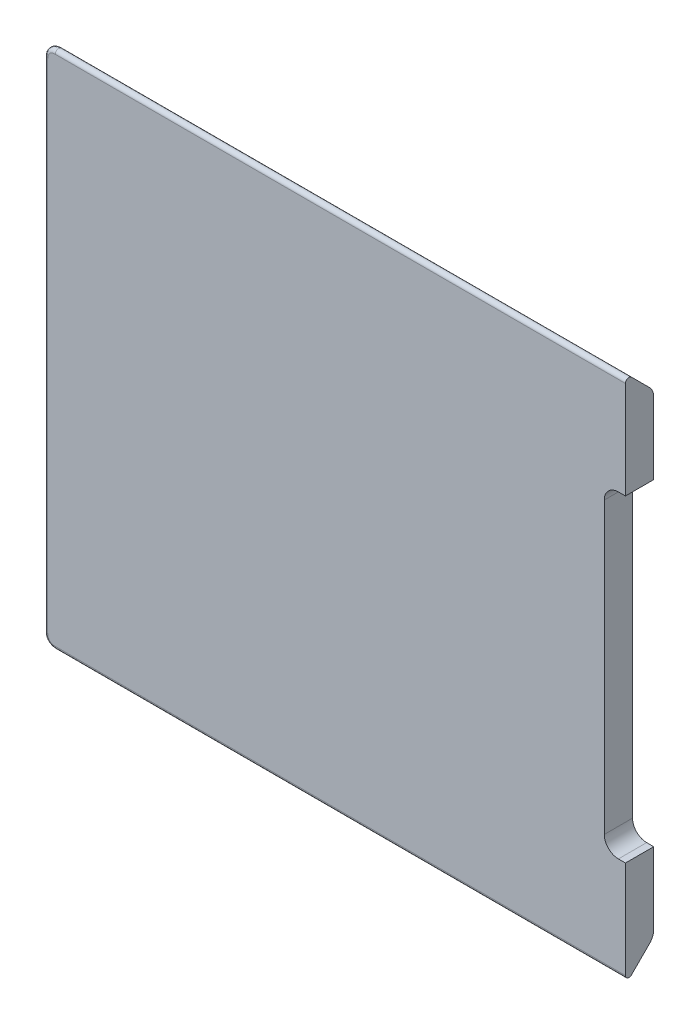
ISO-10303-21;
HEADER;
FILE_DESCRIPTION(('STEP AP214'),'2;1');
FILE_NAME('part.step','',(''),(''),'','','');
FILE_SCHEMA(('AUTOMOTIVE_DESIGN { 1 0 10303 214 1 1 1 1 }'));
ENDSEC;
DATA;
#1=APPLICATION_CONTEXT('core data for automotive mechanical design processes');
#2=APPLICATION_PROTOCOL_DEFINITION('international standard','automotive_design',2000,#1);
#3=PRODUCT_CONTEXT('',#1,'mechanical');
#4=PRODUCT('Part','Part','',(#3));
#5=PRODUCT_RELATED_PRODUCT_CATEGORY('part','',(#4));
#6=PRODUCT_DEFINITION_FORMATION('','',#4);
#7=PRODUCT_DEFINITION_CONTEXT('part definition',#1,'design');
#8=PRODUCT_DEFINITION('design','',#6,#7);
#9=PRODUCT_DEFINITION_SHAPE('','',#8);
#10=(LENGTH_UNIT() NAMED_UNIT(*) SI_UNIT(.MILLI.,.METRE.));
#11=(NAMED_UNIT(*) PLANE_ANGLE_UNIT() SI_UNIT($,.RADIAN.));
#12=(NAMED_UNIT(*) SI_UNIT($,.STERADIAN.) SOLID_ANGLE_UNIT());
#13=UNCERTAINTY_MEASURE_WITH_UNIT(LENGTH_MEASURE(1.E-05),#10,'distance_accuracy_value','');
#14=(GEOMETRIC_REPRESENTATION_CONTEXT(3) GLOBAL_UNCERTAINTY_ASSIGNED_CONTEXT((#13)) GLOBAL_UNIT_ASSIGNED_CONTEXT((#10,
#11,#12)) REPRESENTATION_CONTEXT('',''));
#15=CARTESIAN_POINT('',(0.,0.,0.));
#16=DIRECTION('',(0.,0.,1.));
#17=DIRECTION('',(1.,0.,0.));
#18=AXIS2_PLACEMENT_3D('',#15,#16,#17);
#19=CARTESIAN_POINT('',(-3.00496428663334,-69.8231491568325,36.6728417155403));
#20=CARTESIAN_POINT('',(-3.0049642866328,-69.6417599665671,36.6728417155394));
#21=CARTESIAN_POINT('',(-2.94169411988399,-69.3107853670417,36.6728417155379));
#22=CARTESIAN_POINT('',(-2.62026495891638,-68.8928204622767,36.6728417155359));
#23=CARTESIAN_POINT('',(-2.22699450196718,-68.7730955867716,36.6728417155354));
#24=CARTESIAN_POINT('',(-1.95491071656874,-68.7730955867714,36.6728417155354));
#25=CARTESIAN_POINT('',(-3.11604202688526,-69.8231491568321,36.6728417155403));
#26=CARTESIAN_POINT('',(-3.11874544267914,-69.6289801714833,36.6728860846063));
#27=CARTESIAN_POINT('',(-3.05717731561895,-69.2651335654739,36.6729506764739));
#28=CARTESIAN_POINT('',(-2.68916523885976,-68.7830387092416,36.6729798260699));
#29=CARTESIAN_POINT('',(-2.24616419459224,-68.6579627228283,36.6729082691352));
#30=CARTESIAN_POINT('',(-1.95491071656882,-68.6620178465197,36.6728417155349));
#31=CARTESIAN_POINT('',(-3.33797296559265,-69.8231491568319,36.595153565734));
#32=CARTESIAN_POINT('',(-3.34607701863612,-69.6034179349615,36.5911989278276));
#33=CARTESIAN_POINT('',(-3.28797598094053,-69.1739449843441,36.5842014219234));
#34=CARTESIAN_POINT('',(-2.82680672200666,-68.5636316265411,36.5812229193344));
#35=CARTESIAN_POINT('',(-2.28450754937456,-68.4279308282474,36.5892216088699));
#36=CARTESIAN_POINT('',(-1.95491071656898,-68.4400869078132,36.5951535657278));
#37=CARTESIAN_POINT('',(-3.50968083144635,-69.8231491568326,36.3215003048124));
#38=CARTESIAN_POINT('',(-3.51571206277398,-69.5836147494334,36.3059013845933));
#39=CARTESIAN_POINT('',(-3.44727777278209,-69.1085180758411,36.2790321294264));
#40=CARTESIAN_POINT('',(-2.92049494913923,-68.4159585207845,36.2678463301518));
#41=CARTESIAN_POINT('',(-2.31421232766808,-68.2593321949684,36.2981019244797));
#42=CARTESIAN_POINT('',(-1.9549107165691,-68.2683790419606,36.3215003048065));
#43=CARTESIAN_POINT('',(-3.5009973500986,-69.823149156834,36.0348337081705));
#44=CARTESIAN_POINT('',(-3.49552275177714,-69.5846419368623,36.0120697821309));
#45=CARTESIAN_POINT('',(-3.40415970385293,-69.121168241449,35.9747058155872));
#46=CARTESIAN_POINT('',(-2.89268977031777,-68.4633909706156,35.9597698201485));
#47=CARTESIAN_POINT('',(-2.31267154652697,-68.28527442079,36.0006878191078));
#48=CARTESIAN_POINT('',(-1.95491071656909,-68.2770625233087,36.0348337081653));
#49=CARTESIAN_POINT('',(-3.41389001084896,-69.8231491568349,35.8867317263812));
#50=CARTESIAN_POINT('',(-3.39859972627252,-69.5946289625485,35.8646262894568));
#51=CARTESIAN_POINT('',(-3.29151917534255,-69.1630700849447,35.8304125853742));
#52=CARTESIAN_POINT('',(-2.8240975646465,-68.5744360054401,35.817462641883));
#53=CARTESIAN_POINT('',(-2.29769100799933,-68.3871052894218,35.8535735709916));
#54=CARTESIAN_POINT('',(-1.95491071656903,-68.3641698625581,35.8867317263763));
#55=CARTESIAN_POINT('',(-3.3549821433207,-69.8231491568354,35.827823858853));
#56=CARTESIAN_POINT('',(-3.33482778884606,-69.6014512576221,35.8076695043779));
#57=CARTESIAN_POINT('',(-3.22072262953946,-69.1898967285637,35.7779245674011));
#58=CARTESIAN_POINT('',(-2.78142422116171,-68.6433363826317,35.7671983736439));
#59=CARTESIAN_POINT('',(-2.28745756538958,-68.4533092617972,35.7975923271375));
#60=CARTESIAN_POINT('',(-1.95491071656899,-68.4230777300862,35.8278238588482));
#61=B_SPLINE_SURFACE_WITH_KNOTS('',3,3,((#19,#20,#21,#22,#23,#24),(#25,#26,#27,#28,#29,#30),
(#31,#32,#33,#34,#35,#36),(#37,#38,#39,#40,#41,#42),(#43,#44,#45,#46,#47,#48),(#49,#50,#51,#52,
#53,#54),(#55,#56,#57,#58,#59,#60)),.UNSPECIFIED.,.F.,.F.,.F.,(4,1,1,1,4),(4,1,1,4),(0.,
0.285714285714286,0.571428571428571,0.785714285714286,1.),(-0.523598775597764,
-0.224399475255628,0.0747998250865082,0.523598775599713),.UNSPECIFIED.);
#62=CARTESIAN_POINT('',(-3.00496428663334,-69.8231491568325,36.6728417155403));
#63=CARTESIAN_POINT('',(-3.0049642866328,-69.6417599665671,36.6728417155394));
#64=CARTESIAN_POINT('',(-2.94169411988399,-69.3107853670417,36.6728417155379));
#65=CARTESIAN_POINT('',(-2.62026495891638,-68.8928204622767,36.6728417155359));
#66=CARTESIAN_POINT('',(-2.22699450196718,-68.7730955867716,36.6728417155354));
#67=CARTESIAN_POINT('',(-1.95491071656874,-68.7730955867714,36.6728417155354));
#68=B_SPLINE_CURVE_WITH_KNOTS('',3,(#62,#63,#64,#65,#66,#67),.UNSPECIFIED.,.F.,.F.,(4,1,1,4),
(-0.523598775597764,-0.224399475255628,0.0747998250865082,0.523598775599713),.UNSPECIFIED.);
#69=CARTESIAN_POINT('',(-1.95491071656881,-68.7730955867729,36.6728417155354));
#70=VERTEX_POINT('',#69);
#71=CARTESIAN_POINT('',(-3.00496428663383,-69.8231491568325,36.6728417155403));
#72=VERTEX_POINT('',#71);
#73=EDGE_CURVE('E506',#70,#72,#68,.F.);
#74=CARTESIAN_POINT('',(-1.95491071656874,-68.7730955867714,36.6728417155354));
#75=CARTESIAN_POINT('',(-1.95491071656882,-68.6620178465197,36.6728417155349));
#76=CARTESIAN_POINT('',(-1.95491071656898,-68.4400869078132,36.5951535657278));
#77=CARTESIAN_POINT('',(-1.9549107165691,-68.2683790419606,36.3215003048065));
#78=CARTESIAN_POINT('',(-1.95491071656909,-68.2770625233087,36.0348337081653));
#79=CARTESIAN_POINT('',(-1.95491071656903,-68.3641698625581,35.8867317263763));
#80=CARTESIAN_POINT('',(-1.95491071656899,-68.4230777300862,35.8278238588482));
#81=B_SPLINE_CURVE_WITH_KNOTS('',3,(#74,#75,#76,#77,#78,#79,#80),.UNSPECIFIED.,.F.,.F.,(4,1,1,1,
4),(0.,0.285714285714286,0.571428571428571,0.785714285714286,1.),.UNSPECIFIED.);
#82=CARTESIAN_POINT('',(-1.9549107165689,-68.423077730088,35.8278238588481));
#83=VERTEX_POINT('',#82);
#84=EDGE_CURVE('E510',#83,#70,#81,.F.);
#85=CARTESIAN_POINT('',(-1.95491071656899,-68.4230777300862,35.8278238588482));
#86=CARTESIAN_POINT('',(-2.28745756538958,-68.4533092617972,35.7975923271375));
#87=CARTESIAN_POINT('',(-2.78142422116171,-68.6433363826317,35.7671983736439));
#88=CARTESIAN_POINT('',(-3.22072262953946,-69.1898967285637,35.7779245674011));
#89=CARTESIAN_POINT('',(-3.33482778884606,-69.6014512576221,35.8076695043779));
#90=CARTESIAN_POINT('',(-3.3549821433207,-69.8231491568354,35.827823858853));
#91=B_SPLINE_CURVE_WITH_KNOTS('',3,(#85,#86,#87,#88,#89,#90),.UNSPECIFIED.,.F.,.F.,(4,1,1,4),
(-0.523598775597764,-0.0747998250845592,0.224399475257577,0.523598775599713),.UNSPECIFIED.);
#92=CARTESIAN_POINT('',(-3.35498214334945,-69.82314915678,35.8278238588801));
#93=VERTEX_POINT('',#92);
#94=EDGE_CURVE('E125',#93,#83,#91,.F.);
#95=CARTESIAN_POINT('',(-3.3549821433207,-69.8231491568354,35.827823858853));
#96=CARTESIAN_POINT('',(-3.41389001084896,-69.8231491568349,35.8867317263812));
#97=CARTESIAN_POINT('',(-3.5009973500986,-69.823149156834,36.0348337081705));
#98=CARTESIAN_POINT('',(-3.50968083144635,-69.8231491568326,36.3215003048124));
#99=CARTESIAN_POINT('',(-3.33797296559265,-69.8231491568319,36.595153565734));
#100=CARTESIAN_POINT('',(-3.11604202688526,-69.8231491568321,36.6728417155403));
#101=CARTESIAN_POINT('',(-3.00496428663334,-69.8231491568325,36.6728417155403));
#102=B_SPLINE_CURVE_WITH_KNOTS('',3,(#95,#96,#97,#98,#99,#100,#101),.UNSPECIFIED.,.F.,.F.,(4,1,
1,1,4),(0.,0.214285714285714,0.428571428571429,0.714285714285714,1.),.UNSPECIFIED.);
#103=EDGE_CURVE('E116',#72,#93,#102,.F.);
#104=ORIENTED_EDGE('',*,*,#73,.F.);
#105=ORIENTED_EDGE('',*,*,#84,.F.);
#106=ORIENTED_EDGE('',*,*,#94,.F.);
#107=ORIENTED_EDGE('',*,*,#103,.F.);
#108=EDGE_LOOP('',(#104,#105,#106,#107));
#109=FACE_BOUND('',#108,.T.);
#110=ADVANCED_FACE('F17',(#109),#61,.F.);
#111=CARTESIAN_POINT('',(0.580142853498731,-72.3582027269058,34.6928417155298));
#112=DIRECTION('',(-0.270598050073099,0.270598050073099,-0.923879532511287));
#113=DIRECTION('',(0.959682982260667,0.,-0.281084637714821));
#114=AXIS2_PLACEMENT_3D('',#111,#112,#113);
#115=SPHERICAL_SURFACE('',#114,1.98);
#116=CARTESIAN_POINT('',(0.0443587143539955,-71.8224185877611,32.8635602411575));
#117=VERTEX_POINT('',#116);
#118=VERTEX_LOOP('',#117);
#119=FACE_BOUND('',#118,.T.);
#120=CARTESIAN_POINT('',(0.580142853498731,-72.3582027269058,34.6928417155298));
#121=DIRECTION('',(1.,0.,0.));
#122=DIRECTION('',(0.,0.,-1.));
#123=AXIS2_PLACEMENT_3D('',#120,#121,#122);
#124=CIRCLE('',#123,1.98);
#125=CARTESIAN_POINT('',(0.580142853498731,-72.3582027269058,32.7128417155298));
#126=VERTEX_POINT('',#125);
#127=CARTESIAN_POINT('',(0.580142853498721,-70.9581313001564,33.2927702887805));
#128=VERTEX_POINT('',#127);
#129=EDGE_CURVE('E118',#126,#128,#124,.T.);
#130=ORIENTED_EDGE('',*,*,#129,.F.);
#131=CARTESIAN_POINT('',(0.580142853498731,-72.3582027269058,34.6928417155298));
#132=DIRECTION('',(0.,-1.,0.));
#133=DIRECTION('',(0.,0.,-1.));
#134=AXIS2_PLACEMENT_3D('',#131,#132,#133);
#135=CIRCLE('',#134,1.98);
#136=CARTESIAN_POINT('',(-0.819928573250678,-72.3582027269058,33.2927702887805));
#137=VERTEX_POINT('',#136);
#138=EDGE_CURVE('E24',#126,#137,#135,.F.);
#139=ORIENTED_EDGE('',*,*,#138,.T.);
#140=CARTESIAN_POINT('',(0.580142853498698,-72.3582027269058,34.6928417155298));
#141=DIRECTION('',(0.577350269189626,-0.577350269189625,-0.577350269189626));
#142=DIRECTION('',(-0.707106781186547,0.,-0.707106781186547));
#143=AXIS2_PLACEMENT_3D('',#140,#141,#142);
#144=CIRCLE('',#143,1.98);
#145=EDGE_CURVE('E121',#128,#137,#144,.F.);
#146=ORIENTED_EDGE('',*,*,#145,.F.);
#147=EDGE_LOOP('',(#130,#139,#146));
#148=FACE_BOUND('',#147,.T.);
#149=ADVANCED_FACE('F120',(#119,#148),#115,.T.);
#150=CARTESIAN_POINT('',(-1.95491071690341,-140.633024160384,36.6728417158714));
#151=CARTESIAN_POINT('',(-2.22699450230281,-140.633024160384,36.6728417158714));
#152=CARTESIAN_POINT('',(-2.62025383510631,-140.513284038942,36.6728417158709));
#153=CARTESIAN_POINT('',(-2.94168802214441,-140.095326470196,36.6728417158689));
#154=CARTESIAN_POINT('',(-3.00496428696518,-139.764359780586,36.6728417158673));
#155=CARTESIAN_POINT('',(-3.00496428696446,-139.582970590319,36.6728417158665));
#156=CARTESIAN_POINT('',(-1.95491071690321,-140.744101900636,36.6728417158719));
#157=CARTESIAN_POINT('',(-2.24616419492771,-140.748157024328,36.6729082694723));
#158=CARTESIAN_POINT('',(-2.68920792701886,-140.623045714494,36.6729922075104));
#159=CARTESIAN_POINT('',(-3.0572039477673,-140.140971717587,36.672958956598));
#160=CARTESIAN_POINT('',(-3.11874544301159,-139.777139575668,36.6728860849343));
#161=CARTESIAN_POINT('',(-3.11604202721637,-139.582970590319,36.6728417158665));
#162=CARTESIAN_POINT('',(-1.95491071690283,-140.966031054386,36.595144452796));
#163=CARTESIAN_POINT('',(-2.28450754970972,-140.978187133953,36.589212495938));
#164=CARTESIAN_POINT('',(-2.82696347593654,-140.842421339197,36.5812107983052));
#165=CARTESIAN_POINT('',(-3.28807399838253,-140.232150673551,36.5841898209763));
#166=CARTESIAN_POINT('',(-3.34607523401095,-139.802701812189,36.5911898148856));
#167=CARTESIAN_POINT('',(-3.33797118096597,-139.582970590318,36.5951444527899));
#168=CARTESIAN_POINT('',(-1.95491071690254,-141.137737082671,36.3214961519573));
#169=CARTESIAN_POINT('',(-2.31421232800284,-141.146783929665,36.2980977716301));
#170=CARTESIAN_POINT('',(-2.92070150272886,-140.990089968671,36.2678448666628));
#171=CARTESIAN_POINT('',(-3.44740901166946,-140.297576884246,36.2790281626689));
#172=CARTESIAN_POINT('',(-3.51570844057935,-139.822504997719,36.3058972317345));
#173=CARTESIAN_POINT('',(-3.50967720925006,-139.582970590319,36.3214961519514));
#174=CARTESIAN_POINT('',(-1.95491071690255,-141.129051708278,36.034831063988));
#175=CARTESIAN_POINT('',(-2.31267154686145,-141.120839810798,36.0006851749299));
#176=CARTESIAN_POINT('',(-2.89280598781092,-140.942665083103,35.9597609089001));
#177=CARTESIAN_POINT('',(-3.40423096759155,-140.284926243157,35.9746972257442));
#178=CARTESIAN_POINT('',(-3.49551723653683,-139.821477810293,36.0120671379453));
#179=CARTESIAN_POINT('',(-3.50099183485664,-139.58297059032,36.0348310639828));
#180=CARTESIAN_POINT('',(-1.9549107169027,-141.041949884602,35.8867317267125));
#181=CARTESIAN_POINT('',(-2.29769100833374,-141.019014457739,35.8535735713271));
#182=CARTESIAN_POINT('',(-2.82414213081282,-140.831665166817,35.8174643697151));
#183=CARTESIAN_POINT('',(-3.29155106943329,-140.243042040226,35.8304127615578));
#184=CARTESIAN_POINT('',(-3.39859972660533,-139.811490784609,35.8646262897853));
#185=CARTESIAN_POINT('',(-3.41389001118018,-139.582970590321,35.8867317267076));
#186=CARTESIAN_POINT('',(-1.9549107169028,-140.983042017073,35.8278238591841));
#187=CARTESIAN_POINT('',(-2.28745756572399,-140.952810485363,35.7975923274728));
#188=CARTESIAN_POINT('',(-2.78141231931042,-140.762765966622,35.767201303988));
#189=CARTESIAN_POINT('',(-3.22071605555198,-140.216214028485,35.7779261241758));
#190=CARTESIAN_POINT('',(-3.33482778917884,-139.804668489536,35.8076695047063));
#191=CARTESIAN_POINT('',(-3.35498214365196,-139.582970590322,35.8278238591793));
#192=B_SPLINE_SURFACE_WITH_KNOTS('',3,3,((#150,#151,#152,#153,#154,#155),(#156,#157,#158,#159,
#160,#161),(#162,#163,#164,#165,#166,#167),(#168,#169,#170,#171,#172,#173),(#174,#175,#176,#177,
#178,#179),(#180,#181,#182,#183,#184,#185),(#186,#187,#188,#189,#190,#191)),.UNSPECIFIED.,.F.,
.F.,.F.,(4,1,1,1,4),(4,1,1,4),(0.,0.285714285714286,0.571428571428571,0.785714285714286,1.),
(-0.523598775597767,-0.0747998250845623,0.224399475257574,0.523598775599711),.UNSPECIFIED.);
#193=CARTESIAN_POINT('',(-1.95491071690341,-140.633024160384,36.6728417158714));
#194=CARTESIAN_POINT('',(-2.22699450230281,-140.633024160384,36.6728417158714));
#195=CARTESIAN_POINT('',(-2.62025383510631,-140.513284038942,36.6728417158709));
#196=CARTESIAN_POINT('',(-2.94168802214441,-140.095326470196,36.6728417158689));
#197=CARTESIAN_POINT('',(-3.00496428696518,-139.764359780586,36.6728417158673));
#198=CARTESIAN_POINT('',(-3.00496428696446,-139.582970590319,36.6728417158665));
#199=B_SPLINE_CURVE_WITH_KNOTS('',3,(#193,#194,#195,#196,#197,#198),.UNSPECIFIED.,.F.,.F.,(4,1,
1,4),(-0.523598775597767,-0.0747998250845623,0.224399475257574,0.523598775599711),.UNSPECIFIED.);
#200=CARTESIAN_POINT('',(-3.00496428696299,-139.582970590319,36.6728417158665));
#201=VERTEX_POINT('',#200);
#202=CARTESIAN_POINT('',(-1.95491071690341,-140.633024160384,36.6728417158714));
#203=VERTEX_POINT('',#202);
#204=EDGE_CURVE('E332',#201,#203,#199,.F.);
#205=CARTESIAN_POINT('',(-3.00496428696446,-139.582970590319,36.6728417158665));
#206=CARTESIAN_POINT('',(-3.11604202721637,-139.582970590319,36.6728417158665));
#207=CARTESIAN_POINT('',(-3.33797118096597,-139.582970590318,36.5951444527899));
#208=CARTESIAN_POINT('',(-3.50967720925006,-139.582970590319,36.3214961519514));
#209=CARTESIAN_POINT('',(-3.50099183485664,-139.58297059032,36.0348310639828));
#210=CARTESIAN_POINT('',(-3.41389001118018,-139.582970590321,35.8867317267076));
#211=CARTESIAN_POINT('',(-3.35498214365196,-139.582970590322,35.8278238591793));
#212=B_SPLINE_CURVE_WITH_KNOTS('',3,(#205,#206,#207,#208,#209,#210,#211),.UNSPECIFIED.,.F.,.F.,
(4,1,1,1,4),(0.,0.285714285714286,0.571428571428571,0.785714285714286,1.),.UNSPECIFIED.);
#213=CARTESIAN_POINT('',(-3.35498214365021,-139.582970590322,35.8278238591792));
#214=VERTEX_POINT('',#213);
#215=EDGE_CURVE('E115',#214,#201,#212,.F.);
#216=CARTESIAN_POINT('',(-3.35498214365196,-139.582970590322,35.8278238591793));
#217=CARTESIAN_POINT('',(-3.33482778917884,-139.804668489536,35.8076695047063));
#218=CARTESIAN_POINT('',(-3.22071605555198,-140.216214028485,35.7779261241758));
#219=CARTESIAN_POINT('',(-2.78141231931042,-140.762765966622,35.767201303988));
#220=CARTESIAN_POINT('',(-2.28745756572399,-140.952810485363,35.7975923274728));
#221=CARTESIAN_POINT('',(-1.9549107169028,-140.983042017073,35.8278238591841));
#222=B_SPLINE_CURVE_WITH_KNOTS('',3,(#216,#217,#218,#219,#220,#221),.UNSPECIFIED.,.F.,.F.,(4,1,
1,4),(-0.523598775597767,-0.22439947525563,0.0747998250865063,0.523598775599711),.UNSPECIFIED.);
#223=CARTESIAN_POINT('',(-1.95491071690361,-140.983042017075,35.8278238591841));
#224=VERTEX_POINT('',#223);
#225=EDGE_CURVE('E431',#224,#214,#222,.F.);
#226=CARTESIAN_POINT('',(-1.9549107169028,-140.983042017073,35.8278238591841));
#227=CARTESIAN_POINT('',(-1.9549107169027,-141.041949884602,35.8867317267125));
#228=CARTESIAN_POINT('',(-1.95491071690255,-141.129051708278,36.034831063988));
#229=CARTESIAN_POINT('',(-1.95491071690254,-141.137737082671,36.3214961519573));
#230=CARTESIAN_POINT('',(-1.95491071690283,-140.966031054386,36.595144452796));
#231=CARTESIAN_POINT('',(-1.95491071690321,-140.744101900636,36.6728417158719));
#232=CARTESIAN_POINT('',(-1.95491071690341,-140.633024160384,36.6728417158714));
#233=B_SPLINE_CURVE_WITH_KNOTS('',3,(#226,#227,#228,#229,#230,#231,#232),.UNSPECIFIED.,.F.,.F.,
(4,1,1,1,4),(0.,0.214285714285714,0.428571428571429,0.714285714285714,1.),.UNSPECIFIED.);
#234=EDGE_CURVE('E195',#203,#224,#233,.F.);
#235=ORIENTED_EDGE('',*,*,#204,.F.);
#236=ORIENTED_EDGE('',*,*,#215,.F.);
#237=ORIENTED_EDGE('',*,*,#225,.F.);
#238=ORIENTED_EDGE('',*,*,#234,.F.);
#239=EDGE_LOOP('',(#235,#236,#237,#238));
#240=FACE_BOUND('',#239,.T.);
#241=ADVANCED_FACE('F19',(#240),#192,.F.);
#242=CARTESIAN_POINT('',(0.580142853498731,-137.047917019923,34.6928417155298));
#243=DIRECTION('',(-0.270598050073095,-0.270598050073101,-0.923879532511287));
#244=DIRECTION('',(0.959682982260668,0.,-0.281084637714817));
#245=AXIS2_PLACEMENT_3D('',#242,#243,#244);
#246=SPHERICAL_SURFACE('',#245,1.98);
#247=CARTESIAN_POINT('',(0.0443587143540025,-137.583701159068,32.8635602411575));
#248=VERTEX_POINT('',#247);
#249=VERTEX_LOOP('',#248);
#250=FACE_BOUND('',#249,.T.);
#251=CARTESIAN_POINT('',(0.580142853498731,-137.047917019923,34.6928417155298));
#252=DIRECTION('',(0.,-1.,0.));
#253=DIRECTION('',(0.,0.,-1.));
#254=AXIS2_PLACEMENT_3D('',#251,#252,#253);
#255=CIRCLE('',#254,1.98);
#256=CARTESIAN_POINT('',(0.580142853498737,-137.047917019923,32.7128417155298));
#257=VERTEX_POINT('',#256);
#258=CARTESIAN_POINT('',(-0.819928573250641,-137.047917019923,33.2927702887804));
#259=VERTEX_POINT('',#258);
#260=EDGE_CURVE('E435',#257,#259,#255,.F.);
#261=ORIENTED_EDGE('',*,*,#260,.F.);
#262=CARTESIAN_POINT('',(0.580142853498743,-137.047917019923,34.6928417155298));
#263=DIRECTION('',(-1.,0.,0.));
#264=DIRECTION('',(0.,0.,1.));
#265=AXIS2_PLACEMENT_3D('',#262,#263,#264);
#266=CIRCLE('',#265,1.98);
#267=CARTESIAN_POINT('',(0.580142853498772,-138.447988446672,33.2927702887803));
#268=VERTEX_POINT('',#267);
#269=EDGE_CURVE('E442',#268,#257,#266,.F.);
#270=ORIENTED_EDGE('',*,*,#269,.F.);
#271=CARTESIAN_POINT('',(0.580142853498795,-137.047917019923,34.6928417155298));
#272=DIRECTION('',(-0.577350269189625,-0.577350269189628,0.577350269189625));
#273=DIRECTION('',(0.,-0.707106781186546,-0.707106781186549));
#274=AXIS2_PLACEMENT_3D('',#271,#272,#273);
#275=CIRCLE('',#274,1.98);
#276=EDGE_CURVE('E426',#259,#268,#275,.T.);
#277=ORIENTED_EDGE('',*,*,#276,.F.);
#278=EDGE_LOOP('',(#261,#270,#277));
#279=FACE_BOUND('',#278,.T.);
#280=ADVANCED_FACE('F157',(#250,#279),#246,.T.);
#281=CARTESIAN_POINT('',(0.750000000000002,-137.047917019923,34.6928417155298));
#282=DIRECTION('',(-1.,0.,0.));
#283=DIRECTION('',(0.,0.,1.));
#284=AXIS2_PLACEMENT_3D('',#281,#282,#283);
#285=CYLINDRICAL_SURFACE('',#284,1.98);
#286=ORIENTED_EDGE('',*,*,#269,.T.);
#287=DIRECTION('',(-1.,0.,0.));
#288=VECTOR('',#287,1.);
#289=CARTESIAN_POINT('',(0.750000000000002,-137.047917019923,32.7128417155298));
#290=LINE('',#289,#288);
#291=CARTESIAN_POINT('',(77.97,-137.047917019923,32.7128417155298));
#292=VERTEX_POINT('',#291);
#293=EDGE_CURVE('E140',#292,#257,#290,.T.);
#294=ORIENTED_EDGE('',*,*,#293,.F.);
#295=CARTESIAN_POINT('',(77.97,-137.047917019923,34.6928417155298));
#296=DIRECTION('',(-1.,0.,0.));
#297=DIRECTION('',(0.,0.,1.));
#298=AXIS2_PLACEMENT_3D('',#295,#296,#297);
#299=CIRCLE('',#298,1.98);
#300=CARTESIAN_POINT('',(77.97,-138.447988446672,33.2927702887803));
#301=VERTEX_POINT('',#300);
#302=EDGE_CURVE('E444',#292,#301,#299,.T.);
#303=ORIENTED_EDGE('',*,*,#302,.T.);
#304=DIRECTION('',(1.,0.,0.));
#305=VECTOR('',#304,1.);
#306=CARTESIAN_POINT('',(0.750000000000002,-138.447988446672,33.2927702887801));
#307=LINE('',#306,#305);
#308=EDGE_CURVE('E416',#268,#301,#307,.T.);
#309=ORIENTED_EDGE('',*,*,#308,.F.);
#310=EDGE_LOOP('',(#286,#294,#303,#309));
#311=FACE_BOUND('',#310,.T.);
#312=ADVANCED_FACE('F161',(#311),#285,.T.);
#313=CARTESIAN_POINT('',(0.750000000000002,-72.3582027269058,34.6928417155298));
#314=DIRECTION('',(1.,0.,0.));
#315=DIRECTION('',(0.,0.,-1.));
#316=AXIS2_PLACEMENT_3D('',#313,#314,#315);
#317=CYLINDRICAL_SURFACE('',#316,1.98);
#318=ORIENTED_EDGE('',*,*,#129,.T.);
#319=DIRECTION('',(1.,0.,0.));
#320=VECTOR('',#319,1.);
#321=CARTESIAN_POINT('',(0.750000000000002,-70.9581313001564,33.2927702887805));
#322=LINE('',#321,#320);
#323=CARTESIAN_POINT('',(77.97,-70.9581313001564,33.2927702887805));
#324=VERTEX_POINT('',#323);
#325=EDGE_CURVE('E141',#324,#128,#322,.F.);
#326=ORIENTED_EDGE('',*,*,#325,.F.);
#327=CARTESIAN_POINT('',(77.97,-72.3582027269058,34.6928417155298));
#328=DIRECTION('',(1.,0.,0.));
#329=DIRECTION('',(0.,0.,-1.));
#330=AXIS2_PLACEMENT_3D('',#327,#328,#329);
#331=CIRCLE('',#330,1.98);
#332=CARTESIAN_POINT('',(77.97,-72.3582027269058,32.7128417155298));
#333=VERTEX_POINT('',#332);
#334=EDGE_CURVE('E126',#324,#333,#331,.F.);
#335=ORIENTED_EDGE('',*,*,#334,.T.);
#336=DIRECTION('',(-1.,0.,0.));
#337=VECTOR('',#336,1.);
#338=CARTESIAN_POINT('',(0.750000000000002,-72.3582027269058,32.7128417155298));
#339=LINE('',#338,#337);
#340=EDGE_CURVE('E129',#126,#333,#339,.F.);
#341=ORIENTED_EDGE('',*,*,#340,.F.);
#342=EDGE_LOOP('',(#318,#326,#335,#341));
#343=FACE_BOUND('',#342,.T.);
#344=ADVANCED_FACE('F130',(#343),#317,.T.);
#345=CARTESIAN_POINT('',(8.48963095116805,-80.2676908245751,26.7833536178605));
#346=DIRECTION('',(0.577350269189626,-0.577350269189625,-0.577350269189626));
#347=DIRECTION('',(-0.707106781186547,0.,-0.707106781186547));
#348=AXIS2_PLACEMENT_3D('',#345,#346,#347);
#349=CYLINDRICAL_SURFACE('',#348,1.98);
#350=ORIENTED_EDGE('',*,*,#145,.T.);
#351=DIRECTION('',(0.577350269189621,-0.577350269189636,-0.57735026918962));
#352=VECTOR('',#351,1.);
#353=CARTESIAN_POINT('',(-3.35498214332311,-69.8231491568333,35.8278238588529));
#354=LINE('',#353,#352);
#355=EDGE_CURVE('E278',#93,#137,#354,.T.);
#356=ORIENTED_EDGE('',*,*,#355,.F.);
#357=ORIENTED_EDGE('',*,*,#94,.T.);
#358=DIRECTION('',(-0.577350269189631,0.577350269189623,0.577350269189623));
#359=VECTOR('',#358,1.);
#360=CARTESIAN_POINT('',(0.58014285349873,-70.9581313001564,33.2927702887805));
#361=LINE('',#360,#359);
#362=EDGE_CURVE('E144',#128,#83,#361,.T.);
#363=ORIENTED_EDGE('',*,*,#362,.F.);
#364=EDGE_LOOP('',(#350,#356,#357,#363));
#365=FACE_BOUND('',#364,.T.);
#366=ADVANCED_FACE('F287',(#365),#349,.T.);
#367=CARTESIAN_POINT('',(0.580142853498731,-129.57680987342,34.6928417155298));
#368=DIRECTION('',(0.,-1.,0.));
#369=DIRECTION('',(0.,0.,-1.));
#370=AXIS2_PLACEMENT_3D('',#367,#368,#369);
#371=CYLINDRICAL_SURFACE('',#370,1.98);
#372=ORIENTED_EDGE('',*,*,#138,.F.);
#373=DIRECTION('',(0.,1.,0.));
#374=VECTOR('',#373,1.);
#375=CARTESIAN_POINT('',(0.580142853498731,-137.868059873422,32.7128417155298));
#376=LINE('',#375,#374);
#377=EDGE_CURVE('E108',#257,#126,#376,.T.);
#378=ORIENTED_EDGE('',*,*,#377,.F.);
#379=ORIENTED_EDGE('',*,*,#260,.T.);
#380=DIRECTION('',(0.,1.,0.));
#381=VECTOR('',#380,1.);
#382=CARTESIAN_POINT('',(-0.819928573250666,-121.285559873418,33.2927702887805));
#383=LINE('',#382,#381);
#384=EDGE_CURVE('E111',#137,#259,#383,.F.);
#385=ORIENTED_EDGE('',*,*,#384,.F.);
#386=EDGE_LOOP('',(#372,#378,#379,#385));
#387=FACE_BOUND('',#386,.T.);
#388=ADVANCED_FACE('F105',(#387),#371,.T.);
#389=CARTESIAN_POINT('',(1.64213095116686,-135.985928922255,33.6308536178617));
#390=DIRECTION('',(-0.577350269189625,-0.577350269189628,0.577350269189625));
#391=DIRECTION('',(0.,-0.707106781186546,-0.707106781186549));
#392=AXIS2_PLACEMENT_3D('',#389,#390,#391);
#393=CYLINDRICAL_SURFACE('',#392,1.98);
#394=ORIENTED_EDGE('',*,*,#276,.T.);
#395=DIRECTION('',(0.577350269189594,0.577350269189642,-0.577350269189641));
#396=VECTOR('',#395,1.);
#397=CARTESIAN_POINT('',(-1.95491071690489,-140.983042017076,35.827823859184));
#398=LINE('',#397,#396);
#399=EDGE_CURVE('E421',#224,#268,#398,.T.);
#400=ORIENTED_EDGE('',*,*,#399,.F.);
#401=ORIENTED_EDGE('',*,*,#225,.T.);
#402=DIRECTION('',(-0.577350269189609,-0.577350269189661,0.577350269189607));
#403=VECTOR('',#402,1.);
#404=CARTESIAN_POINT('',(-0.819928573250616,-137.047917019923,33.2927702887804));
#405=LINE('',#404,#403);
#406=EDGE_CURVE('E259',#259,#214,#405,.T.);
#407=ORIENTED_EDGE('',*,*,#406,.F.);
#408=EDGE_LOOP('',(#394,#400,#401,#407));
#409=FACE_BOUND('',#408,.T.);
#410=ADVANCED_FACE('F245',(#409),#393,.T.);
#411=CARTESIAN_POINT('',(0.750000000000002,-141.828059873422,36.6728417155298));
#412=DIRECTION('',(0.,-0.707106781186546,-0.707106781186549));
#413=DIRECTION('',(0.,0.707106781186549,-0.707106781186546));
#414=AXIS2_PLACEMENT_3D('',#411,#412,#413);
#415=PLANE('',#414);
#416=ORIENTED_EDGE('',*,*,#308,.T.);
#417=DIRECTION('',(0.,0.707106781186587,-0.707106781186508));
#418=VECTOR('',#417,1.);
#419=CARTESIAN_POINT('',(77.97,-140.983042017076,35.8278238591841));
#420=LINE('',#419,#418);
#421=CARTESIAN_POINT('',(77.97,-140.983042017076,35.8278238591841));
#422=VERTEX_POINT('',#421);
#423=EDGE_CURVE('E386',#422,#301,#420,.T.);
#424=ORIENTED_EDGE('',*,*,#423,.F.);
#425=DIRECTION('',(1.,0.,0.));
#426=VECTOR('',#425,1.);
#427=CARTESIAN_POINT('',(0.750000000000002,-140.983042017076,35.8278238591844));
#428=LINE('',#427,#426);
#429=EDGE_CURVE('E267',#224,#422,#428,.T.);
#430=ORIENTED_EDGE('',*,*,#429,.F.);
#431=ORIENTED_EDGE('',*,*,#399,.T.);
#432=EDGE_LOOP('',(#416,#424,#430,#431));
#433=FACE_BOUND('',#432,.T.);
#434=ADVANCED_FACE('F241',(#433),#415,.T.);
#435=CARTESIAN_POINT('',(76.98,-126.978059873422,32.7128417155298));
#436=DIRECTION('',(0.,-1.,0.));
#437=DIRECTION('',(0.,0.,-1.));
#438=AXIS2_PLACEMENT_3D('',#435,#436,#437);
#439=PLANE('',#438);
#440=DIRECTION('',(0.,0.,-1.));
#441=VECTOR('',#440,1.);
#442=CARTESIAN_POINT('',(77.97,-126.978059873422,34.6928417155437));
#443=LINE('',#442,#441);
#444=CARTESIAN_POINT('',(77.97,-126.978059873422,32.7128417155298));
#445=VERTEX_POINT('',#444);
#446=CARTESIAN_POINT('',(77.97,-126.978059873422,36.6728417158076));
#447=VERTEX_POINT('',#446);
#448=EDGE_CURVE('E385',#445,#447,#443,.F.);
#449=ORIENTED_EDGE('',*,*,#448,.F.);
#450=DIRECTION('',(-1.,0.,0.));
#451=VECTOR('',#450,1.);
#452=CARTESIAN_POINT('',(0.750000000000002,-126.978059873422,32.7128417155298));
#453=LINE('',#452,#451);
#454=CARTESIAN_POINT('',(76.98,-126.978059873422,32.7128417155298));
#455=VERTEX_POINT('',#454);
#456=EDGE_CURVE('E146',#455,#445,#453,.F.);
#457=ORIENTED_EDGE('',*,*,#456,.F.);
#458=DIRECTION('',(0.,0.,1.));
#459=VECTOR('',#458,1.);
#460=CARTESIAN_POINT('',(76.98,-126.978059873422,32.7128417155298));
#461=LINE('',#460,#459);
#462=CARTESIAN_POINT('',(76.98,-126.978059873422,36.6728417158076));
#463=VERTEX_POINT('',#462);
#464=EDGE_CURVE('E378',#455,#463,#461,.T.);
#465=ORIENTED_EDGE('',*,*,#464,.T.);
#466=DIRECTION('',(1.,0.,0.));
#467=VECTOR('',#466,1.);
#468=CARTESIAN_POINT('',(76.98,-126.978059873422,36.6728417158076));
#469=LINE('',#468,#467);
#470=EDGE_CURVE('E410',#447,#463,#469,.F.);
#471=ORIENTED_EDGE('',*,*,#470,.F.);
#472=EDGE_LOOP('',(#449,#457,#465,#471));
#473=FACE_BOUND('',#472,.T.);
#474=ADVANCED_FACE('F237',(#473),#439,.F.);
#475=CARTESIAN_POINT('',(77.97,-82.4280598734071,32.7128417155298));
#476=DIRECTION('',(0.,1.,0.));
#477=DIRECTION('',(0.,0.,1.));
#478=AXIS2_PLACEMENT_3D('',#475,#476,#477);
#479=PLANE('',#478);
#480=DIRECTION('',(0.,0.,1.));
#481=VECTOR('',#480,1.);
#482=CARTESIAN_POINT('',(76.98,-82.4280598734071,32.7128417155298));
#483=LINE('',#482,#481);
#484=CARTESIAN_POINT('',(76.98,-82.4280598734071,36.6728417156039));
#485=VERTEX_POINT('',#484);
#486=CARTESIAN_POINT('',(76.98,-82.4280598734071,32.7128417155298));
#487=VERTEX_POINT('',#486);
#488=EDGE_CURVE('E372',#485,#487,#483,.F.);
#489=ORIENTED_EDGE('',*,*,#488,.T.);
#490=DIRECTION('',(-1.,0.,0.));
#491=VECTOR('',#490,1.);
#492=CARTESIAN_POINT('',(0.750000000000002,-82.4280598734071,32.7128417155298));
#493=LINE('',#492,#491);
#494=CARTESIAN_POINT('',(77.97,-82.4280598734071,32.7128417155298));
#495=VERTEX_POINT('',#494);
#496=EDGE_CURVE('E134',#495,#487,#493,.T.);
#497=ORIENTED_EDGE('',*,*,#496,.F.);
#498=DIRECTION('',(0.,0.,-1.));
#499=VECTOR('',#498,1.);
#500=CARTESIAN_POINT('',(77.97,-82.4280598734071,34.6928417155437));
#501=LINE('',#500,#499);
#502=CARTESIAN_POINT('',(77.97,-82.4280598734071,36.6728417155992));
#503=VERTEX_POINT('',#502);
#504=EDGE_CURVE('E361',#503,#495,#501,.T.);
#505=ORIENTED_EDGE('',*,*,#504,.F.);
#506=DIRECTION('',(1.,0.,0.));
#507=VECTOR('',#506,1.);
#508=CARTESIAN_POINT('',(77.97,-82.4280598734071,36.6728417155992));
#509=LINE('',#508,#507);
#510=EDGE_CURVE('E135',#485,#503,#509,.T.);
#511=ORIENTED_EDGE('',*,*,#510,.F.);
#512=EDGE_LOOP('',(#489,#497,#505,#511));
#513=FACE_BOUND('',#512,.T.);
#514=ADVANCED_FACE('F234',(#513),#479,.F.);
#515=CARTESIAN_POINT('',(0.750000000000002,-137.868059873422,32.7128417155298));
#516=DIRECTION('',(0.,0.,-1.));
#517=DIRECTION('',(-1.,0.,0.));
#518=AXIS2_PLACEMENT_3D('',#515,#516,#517);
#519=PLANE('',#518);
#520=ORIENTED_EDGE('',*,*,#293,.T.);
#521=ORIENTED_EDGE('',*,*,#377,.T.);
#522=ORIENTED_EDGE('',*,*,#340,.T.);
#523=DIRECTION('',(0.,1.,0.));
#524=VECTOR('',#523,1.);
#525=CARTESIAN_POINT('',(77.97,-104.703059873414,32.7128417155298));
#526=LINE('',#525,#524);
#527=EDGE_CURVE('E359',#495,#333,#526,.T.);
#528=ORIENTED_EDGE('',*,*,#527,.F.);
#529=ORIENTED_EDGE('',*,*,#496,.T.);
#530=CARTESIAN_POINT('',(76.98,-84.4080598734071,32.7128417155298));
#531=DIRECTION('',(0.,0.,1.));
#532=DIRECTION('',(1.,0.,0.));
#533=AXIS2_PLACEMENT_3D('',#530,#531,#532);
#534=CIRCLE('',#533,1.98000000000001);
#535=CARTESIAN_POINT('',(75.,-84.4080598734071,32.7128417155298));
#536=VERTEX_POINT('',#535);
#537=EDGE_CURVE('E371',#487,#536,#534,.T.);
#538=ORIENTED_EDGE('',*,*,#537,.T.);
#539=DIRECTION('',(0.,-1.,0.));
#540=VECTOR('',#539,1.);
#541=CARTESIAN_POINT('',(75.,-84.4080598734071,32.7128417155298));
#542=LINE('',#541,#540);
#543=CARTESIAN_POINT('',(75.,-124.998059873422,32.7128417155298));
#544=VERTEX_POINT('',#543);
#545=EDGE_CURVE('E377',#536,#544,#542,.T.);
#546=ORIENTED_EDGE('',*,*,#545,.T.);
#547=CARTESIAN_POINT('',(76.98,-124.998059873422,32.7128417155298));
#548=DIRECTION('',(0.,0.,1.));
#549=DIRECTION('',(1.,0.,0.));
#550=AXIS2_PLACEMENT_3D('',#547,#548,#549);
#551=CIRCLE('',#550,1.98);
#552=EDGE_CURVE('E381',#544,#455,#551,.T.);
#553=ORIENTED_EDGE('',*,*,#552,.T.);
#554=ORIENTED_EDGE('',*,*,#456,.T.);
#555=DIRECTION('',(0.,1.,0.));
#556=VECTOR('',#555,1.);
#557=CARTESIAN_POINT('',(77.97,-104.703059873414,32.7128417155298));
#558=LINE('',#557,#556);
#559=EDGE_CURVE('E382',#292,#445,#558,.T.);
#560=ORIENTED_EDGE('',*,*,#559,.F.);
#561=EDGE_LOOP('',(#520,#521,#522,#528,#529,#538,#546,#553,#554,#560));
#562=FACE_BOUND('',#561,.T.);
#563=ADVANCED_FACE('F137',(#562),#519,.T.);
#564=CARTESIAN_POINT('',(0.750000000000002,-71.5380598734071,32.7128417155298));
#565=DIRECTION('',(0.,0.707106781186548,-0.707106781186547));
#566=DIRECTION('',(0.,0.707106781186547,0.707106781186548));
#567=AXIS2_PLACEMENT_3D('',#564,#565,#566);
#568=PLANE('',#567);
#569=ORIENTED_EDGE('',*,*,#325,.T.);
#570=ORIENTED_EDGE('',*,*,#362,.T.);
#571=DIRECTION('',(1.,0.,0.));
#572=VECTOR('',#571,1.);
#573=CARTESIAN_POINT('',(0.750000000000002,-68.4230777300889,35.827823858848));
#574=LINE('',#573,#572);
#575=CARTESIAN_POINT('',(77.97,-68.4230777300888,35.827823858848));
#576=VERTEX_POINT('',#575);
#577=EDGE_CURVE('E274',#576,#83,#574,.F.);
#578=ORIENTED_EDGE('',*,*,#577,.F.);
#579=DIRECTION('',(0.,0.70710678118656,0.707106781186535));
#580=VECTOR('',#579,1.);
#581=CARTESIAN_POINT('',(77.97,-70.9581313001564,33.2927702887805));
#582=LINE('',#581,#580);
#583=EDGE_CURVE('E357',#324,#576,#582,.T.);
#584=ORIENTED_EDGE('',*,*,#583,.F.);
#585=EDGE_LOOP('',(#569,#570,#578,#584));
#586=FACE_BOUND('',#585,.T.);
#587=ADVANCED_FACE('F227',(#586),#568,.T.);
#588=CARTESIAN_POINT('',(-2.22,-121.285559873418,34.6928417155298));
#589=DIRECTION('',(-0.707106781186547,0.,-0.707106781186548));
#590=DIRECTION('',(-0.707106781186548,0.,0.707106781186547));
#591=AXIS2_PLACEMENT_3D('',#588,#589,#590);
#592=PLANE('',#591);
#593=ORIENTED_EDGE('',*,*,#384,.T.);
#594=ORIENTED_EDGE('',*,*,#406,.T.);
#595=DIRECTION('',(4.67625937972116E-12,1.,-4.67625937972116E-12));
#596=VECTOR('',#595,1.);
#597=CARTESIAN_POINT('',(-3.35498214343817,-94.4318098733996,35.827823858968));
#598=LINE('',#597,#596);
#599=EDGE_CURVE('E270',#93,#214,#598,.F.);
#600=ORIENTED_EDGE('',*,*,#599,.F.);
#601=ORIENTED_EDGE('',*,*,#355,.T.);
#602=EDGE_LOOP('',(#593,#594,#600,#601));
#603=FACE_BOUND('',#602,.T.);
#604=ADVANCED_FACE('F223',(#603),#592,.T.);
#605=CARTESIAN_POINT('',(0.750000000000002,-140.633024160388,36.1778417158714));
#606=DIRECTION('',(1.,0.,0.));
#607=DIRECTION('',(0.,0.,-1.));
#608=AXIS2_PLACEMENT_3D('',#605,#606,#607);
#609=CYLINDRICAL_SURFACE('',#608,0.495);
#610=ORIENTED_EDGE('',*,*,#234,.T.);
#611=ORIENTED_EDGE('',*,*,#429,.T.);
#612=CARTESIAN_POINT('',(77.97,-140.633024160388,36.1778417158714));
#613=DIRECTION('',(1.,0.,0.));
#614=DIRECTION('',(0.,0.,-1.));
#615=AXIS2_PLACEMENT_3D('',#612,#613,#614);
#616=CIRCLE('',#615,0.495);
#617=CARTESIAN_POINT('',(77.97,-140.633024160385,36.6728417158714));
#618=VERTEX_POINT('',#617);
#619=EDGE_CURVE('E339',#618,#422,#616,.T.);
#620=ORIENTED_EDGE('',*,*,#619,.F.);
#621=DIRECTION('',(1.,0.,0.));
#622=VECTOR('',#621,1.);
#623=CARTESIAN_POINT('',(0.750000000000002,-140.633024160384,36.6728417158714));
#624=LINE('',#623,#622);
#625=EDGE_CURVE('E273',#203,#618,#624,.T.);
#626=ORIENTED_EDGE('',*,*,#625,.F.);
#627=EDGE_LOOP('',(#610,#611,#620,#626));
#628=FACE_BOUND('',#627,.T.);
#629=ADVANCED_FACE('F212',(#628),#609,.T.);
#630=CARTESIAN_POINT('',(77.97,-104.703059873414,34.6928417155437));
#631=DIRECTION('',(1.,0.,0.));
#632=DIRECTION('',(0.,0.,-1.));
#633=AXIS2_PLACEMENT_3D('',#630,#631,#632);
#634=PLANE('',#633);
#635=ORIENTED_EDGE('',*,*,#448,.T.);
#636=DIRECTION('',(0.,-1.,4.67625937972116E-12));
#637=VECTOR('',#636,1.);
#638=CARTESIAN_POINT('',(77.97,-67.5780598734071,36.6728417155298));
#639=LINE('',#638,#637);
#640=EDGE_CURVE('E341',#618,#447,#639,.F.);
#641=ORIENTED_EDGE('',*,*,#640,.F.);
#642=ORIENTED_EDGE('',*,*,#619,.T.);
#643=ORIENTED_EDGE('',*,*,#423,.T.);
#644=ORIENTED_EDGE('',*,*,#302,.F.);
#645=ORIENTED_EDGE('',*,*,#559,.T.);
#646=EDGE_LOOP('',(#635,#641,#642,#643,#644,#645));
#647=FACE_BOUND('',#646,.T.);
#648=ADVANCED_FACE('F222',(#647),#634,.T.);
#649=CARTESIAN_POINT('',(76.98,-124.998059873422,32.7128417155298));
#650=DIRECTION('',(0.,0.,1.));
#651=DIRECTION('',(1.,0.,0.));
#652=AXIS2_PLACEMENT_3D('',#649,#650,#651);
#653=CYLINDRICAL_SURFACE('',#652,1.98);
#654=ORIENTED_EDGE('',*,*,#464,.F.);
#655=ORIENTED_EDGE('',*,*,#552,.F.);
#656=DIRECTION('',(0.,0.,1.));
#657=VECTOR('',#656,1.);
#658=CARTESIAN_POINT('',(75.,-124.998059873422,32.7128417155298));
#659=LINE('',#658,#657);
#660=CARTESIAN_POINT('',(75.,-124.998059873422,36.672841715803));
#661=VERTEX_POINT('',#660);
#662=EDGE_CURVE('E374',#544,#661,#659,.T.);
#663=ORIENTED_EDGE('',*,*,#662,.T.);
#664=CARTESIAN_POINT('',(76.98,-124.998059873422,36.6728417158076));
#665=DIRECTION('',(0.,0.,1.));
#666=DIRECTION('',(1.,0.,0.));
#667=AXIS2_PLACEMENT_3D('',#664,#665,#666);
#668=CIRCLE('',#667,1.98);
#669=EDGE_CURVE('E343',#463,#661,#668,.F.);
#670=ORIENTED_EDGE('',*,*,#669,.F.);
#671=EDGE_LOOP('',(#654,#655,#663,#670));
#672=FACE_BOUND('',#671,.T.);
#673=ADVANCED_FACE('F501',(#672),#653,.F.);
#674=CARTESIAN_POINT('',(75.,-84.4080598734071,32.7128417155298));
#675=DIRECTION('',(-1.,0.,0.));
#676=DIRECTION('',(0.,-1.,0.));
#677=AXIS2_PLACEMENT_3D('',#674,#675,#676);
#678=PLANE('',#677);
#679=ORIENTED_EDGE('',*,*,#662,.F.);
#680=ORIENTED_EDGE('',*,*,#545,.F.);
#681=DIRECTION('',(0.,0.,1.));
#682=VECTOR('',#681,1.);
#683=CARTESIAN_POINT('',(75.,-84.4080598734071,32.7128417155298));
#684=LINE('',#683,#682);
#685=CARTESIAN_POINT('',(75.,-84.4080598734071,36.6728417156085));
#686=VERTEX_POINT('',#685);
#687=EDGE_CURVE('E366',#536,#686,#684,.T.);
#688=ORIENTED_EDGE('',*,*,#687,.T.);
#689=DIRECTION('',(0.,-1.,4.67625937972116E-12));
#690=VECTOR('',#689,1.);
#691=CARTESIAN_POINT('',(75.,-67.5780598734071,36.6728417155298));
#692=LINE('',#691,#690);
#693=EDGE_CURVE('E347',#661,#686,#692,.F.);
#694=ORIENTED_EDGE('',*,*,#693,.F.);
#695=EDGE_LOOP('',(#679,#680,#688,#694));
#696=FACE_BOUND('',#695,.T.);
#697=ADVANCED_FACE('F669',(#696),#678,.F.);
#698=CARTESIAN_POINT('',(76.98,-84.4080598734071,32.7128417155298));
#699=DIRECTION('',(0.,0.,1.));
#700=DIRECTION('',(1.,0.,0.));
#701=AXIS2_PLACEMENT_3D('',#698,#699,#700);
#702=CYLINDRICAL_SURFACE('',#701,1.98000000000001);
#703=ORIENTED_EDGE('',*,*,#687,.F.);
#704=ORIENTED_EDGE('',*,*,#537,.F.);
#705=ORIENTED_EDGE('',*,*,#488,.F.);
#706=CARTESIAN_POINT('',(76.98,-84.4080598734071,36.6728417156085));
#707=DIRECTION('',(0.,0.,1.));
#708=DIRECTION('',(1.,0.,0.));
#709=AXIS2_PLACEMENT_3D('',#706,#707,#708);
#710=CIRCLE('',#709,1.98000000000001);
#711=EDGE_CURVE('E354',#686,#485,#710,.F.);
#712=ORIENTED_EDGE('',*,*,#711,.F.);
#713=EDGE_LOOP('',(#703,#704,#705,#712));
#714=FACE_BOUND('',#713,.T.);
#715=ADVANCED_FACE('F483',(#714),#702,.F.);
#716=CARTESIAN_POINT('',(77.97,-104.703059873414,34.6928417155437));
#717=DIRECTION('',(1.,0.,0.));
#718=DIRECTION('',(0.,0.,-1.));
#719=AXIS2_PLACEMENT_3D('',#716,#717,#718);
#720=PLANE('',#719);
#721=ORIENTED_EDGE('',*,*,#334,.F.);
#722=ORIENTED_EDGE('',*,*,#583,.T.);
#723=CARTESIAN_POINT('',(77.97,-68.7730955867762,36.1778417155354));
#724=DIRECTION('',(1.,0.,0.));
#725=DIRECTION('',(0.,0.,-1.));
#726=AXIS2_PLACEMENT_3D('',#723,#724,#725);
#727=CIRCLE('',#726,0.495);
#728=CARTESIAN_POINT('',(77.97,-68.7730955867739,36.6728417155354));
#729=VERTEX_POINT('',#728);
#730=EDGE_CURVE('E39',#729,#576,#727,.F.);
#731=ORIENTED_EDGE('',*,*,#730,.F.);
#732=DIRECTION('',(0.,-1.,4.67625937972116E-12));
#733=VECTOR('',#732,1.);
#734=CARTESIAN_POINT('',(77.97,-67.5780598734071,36.6728417155298));
#735=LINE('',#734,#733);
#736=EDGE_CURVE('E351',#503,#729,#735,.F.);
#737=ORIENTED_EDGE('',*,*,#736,.F.);
#738=ORIENTED_EDGE('',*,*,#504,.T.);
#739=ORIENTED_EDGE('',*,*,#527,.T.);
#740=EDGE_LOOP('',(#721,#722,#731,#737,#738,#739));
#741=FACE_BOUND('',#740,.T.);
#742=ADVANCED_FACE('F503',(#741),#720,.T.);
#743=CARTESIAN_POINT('',(0.750000000000002,-68.7730955867762,36.1778417155354));
#744=DIRECTION('',(1.,0.,0.));
#745=DIRECTION('',(0.,0.,-1.));
#746=AXIS2_PLACEMENT_3D('',#743,#744,#745);
#747=CYLINDRICAL_SURFACE('',#746,0.495);
#748=ORIENTED_EDGE('',*,*,#84,.T.);
#749=DIRECTION('',(1.,0.,0.));
#750=VECTOR('',#749,1.);
#751=CARTESIAN_POINT('',(0.750000000000002,-68.7730955867739,36.6728417155354));
#752=LINE('',#751,#750);
#753=EDGE_CURVE('E30',#729,#70,#752,.F.);
#754=ORIENTED_EDGE('',*,*,#753,.F.);
#755=ORIENTED_EDGE('',*,*,#730,.T.);
#756=ORIENTED_EDGE('',*,*,#577,.T.);
#757=EDGE_LOOP('',(#748,#754,#755,#756));
#758=FACE_BOUND('',#757,.T.);
#759=ADVANCED_FACE('F309',(#758),#747,.T.);
#760=CARTESIAN_POINT('',(-3.00496428675087,-94.4318098733996,36.1778417156554));
#761=DIRECTION('',(4.67625937972116E-12,1.,-4.67625937972116E-12));
#762=DIRECTION('',(0.,4.67625937972116E-12,1.));
#763=AXIS2_PLACEMENT_3D('',#760,#761,#762);
#764=CYLINDRICAL_SURFACE('',#763,0.495);
#765=ORIENTED_EDGE('',*,*,#103,.T.);
#766=ORIENTED_EDGE('',*,*,#599,.T.);
#767=ORIENTED_EDGE('',*,*,#215,.T.);
#768=DIRECTION('',(0.,-1.,4.67625937972116E-12));
#769=VECTOR('',#768,1.);
#770=CARTESIAN_POINT('',(-3.00496428663334,-67.5780598734071,36.6728417155298));
#771=LINE('',#770,#769);
#772=EDGE_CURVE('E11',#72,#201,#771,.T.);
#773=ORIENTED_EDGE('',*,*,#772,.F.);
#774=EDGE_LOOP('',(#765,#766,#767,#773));
#775=FACE_BOUND('',#774,.T.);
#776=ADVANCED_FACE('F303',(#775),#764,.T.);
#777=CARTESIAN_POINT('',(0.750000000000002,-67.5780598734071,36.6728417155298));
#778=DIRECTION('',(0.,4.67625937972116E-12,1.));
#779=DIRECTION('',(0.,-1.,4.67625937972116E-12));
#780=AXIS2_PLACEMENT_3D('',#777,#778,#779);
#781=PLANE('',#780);
#782=ORIENTED_EDGE('',*,*,#772,.T.);
#783=ORIENTED_EDGE('',*,*,#204,.T.);
#784=ORIENTED_EDGE('',*,*,#625,.T.);
#785=ORIENTED_EDGE('',*,*,#640,.T.);
#786=ORIENTED_EDGE('',*,*,#470,.T.);
#787=ORIENTED_EDGE('',*,*,#669,.T.);
#788=ORIENTED_EDGE('',*,*,#693,.T.);
#789=ORIENTED_EDGE('',*,*,#711,.T.);
#790=ORIENTED_EDGE('',*,*,#510,.T.);
#791=ORIENTED_EDGE('',*,*,#736,.T.);
#792=ORIENTED_EDGE('',*,*,#753,.T.);
#793=ORIENTED_EDGE('',*,*,#73,.T.);
#794=EDGE_LOOP('',(#782,#783,#784,#785,#786,#787,#788,#789,#790,#791,#792,#793));
#795=FACE_BOUND('',#794,.T.);
#796=ADVANCED_FACE('F301',(#795),#781,.T.);
#797=CLOSED_SHELL('',(#110,#149,#241,#280,#312,#344,#366,#388,#410,#434,#474,#514,#563,#587,
#604,#629,#648,#673,#697,#715,#742,#759,#776,#796));
#798=MANIFOLD_SOLID_BREP('B1',#797);
#799=ADVANCED_BREP_SHAPE_REPRESENTATION('',(#18,#798),#14);
#800=SHAPE_DEFINITION_REPRESENTATION(#9,#799);
ENDSEC;
END-ISO-10303-21;
